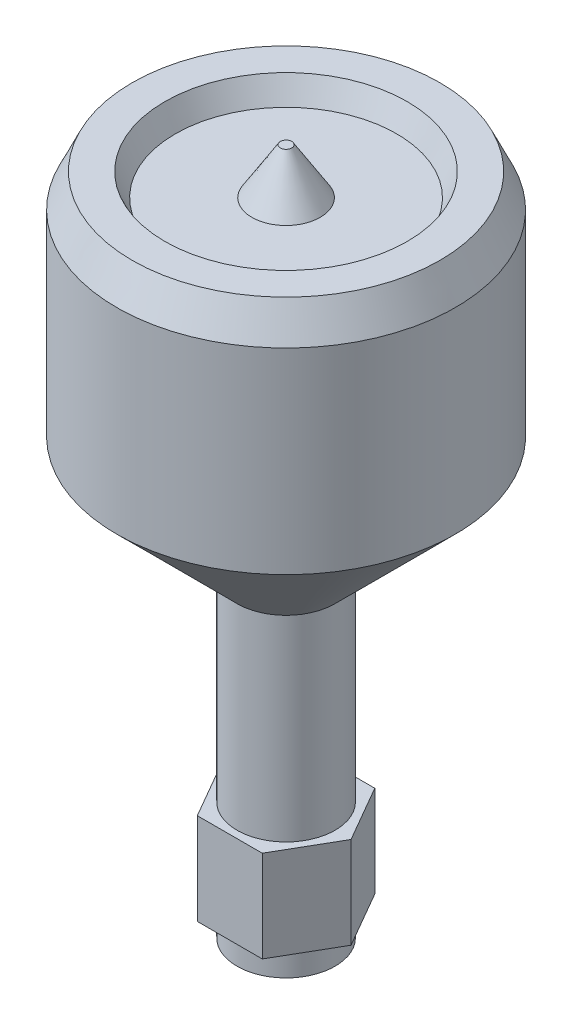
ISO-10303-21;
HEADER;
FILE_DESCRIPTION(('STEP AP214'),'2;1');
FILE_NAME('part.step','',(''),(''),'','','');
FILE_SCHEMA(('AUTOMOTIVE_DESIGN { 1 0 10303 214 1 1 1 1 }'));
ENDSEC;
DATA;
#1=APPLICATION_CONTEXT('core data for automotive mechanical design processes');
#2=APPLICATION_PROTOCOL_DEFINITION('international standard','automotive_design',2000,#1);
#3=PRODUCT_CONTEXT('',#1,'mechanical');
#4=PRODUCT('Part','Part','',(#3));
#5=PRODUCT_RELATED_PRODUCT_CATEGORY('part','',(#4));
#6=PRODUCT_DEFINITION_FORMATION('','',#4);
#7=PRODUCT_DEFINITION_CONTEXT('part definition',#1,'design');
#8=PRODUCT_DEFINITION('design','',#6,#7);
#9=PRODUCT_DEFINITION_SHAPE('','',#8);
#10=(LENGTH_UNIT() NAMED_UNIT(*) SI_UNIT(.MILLI.,.METRE.));
#11=(NAMED_UNIT(*) PLANE_ANGLE_UNIT() SI_UNIT($,.RADIAN.));
#12=(NAMED_UNIT(*) SI_UNIT($,.STERADIAN.) SOLID_ANGLE_UNIT());
#13=UNCERTAINTY_MEASURE_WITH_UNIT(LENGTH_MEASURE(1.E-05),#10,'distance_accuracy_value','');
#14=(GEOMETRIC_REPRESENTATION_CONTEXT(3) GLOBAL_UNCERTAINTY_ASSIGNED_CONTEXT((#13)) GLOBAL_UNIT_ASSIGNED_CONTEXT((#10,
#11,#12)) REPRESENTATION_CONTEXT('',''));
#15=CARTESIAN_POINT('',(0.,0.,0.));
#16=DIRECTION('',(0.,0.,1.));
#17=DIRECTION('',(1.,0.,0.));
#18=AXIS2_PLACEMENT_3D('',#15,#16,#17);
#19=CARTESIAN_POINT('',(2.48260615751539,9.,-4.3));
#20=DIRECTION('',(0.,1.,0.));
#21=DIRECTION('',(-1.,0.,0.));
#22=AXIS2_PLACEMENT_3D('',#19,#20,#21);
#23=PLANE('',#22);
#24=DIRECTION('',(0.5,0.,0.866025403784439));
#25=VECTOR('',#24,1.);
#26=CARTESIAN_POINT('',(2.48260615751539,9.,-4.3));
#27=LINE('',#26,#25);
#28=CARTESIAN_POINT('',(2.48260615751539,9.,-4.3));
#29=VERTEX_POINT('',#28);
#30=CARTESIAN_POINT('',(4.96521231503078,9.,0.));
#31=VERTEX_POINT('',#30);
#32=EDGE_CURVE('E47',#29,#31,#27,.T.);
#33=ORIENTED_EDGE('',*,*,#32,.F.);
#34=DIRECTION('',(1.,0.,0.));
#35=VECTOR('',#34,1.);
#36=CARTESIAN_POINT('',(-2.48260615751539,9.,-4.3));
#37=LINE('',#36,#35);
#38=CARTESIAN_POINT('',(-2.48260615751539,9.,-4.3));
#39=VERTEX_POINT('',#38);
#40=EDGE_CURVE('E129',#39,#29,#37,.T.);
#41=ORIENTED_EDGE('',*,*,#40,.F.);
#42=DIRECTION('',(0.5,0.,-0.866025403784438));
#43=VECTOR('',#42,1.);
#44=CARTESIAN_POINT('',(-4.96521231503078,9.,0.));
#45=LINE('',#44,#43);
#46=CARTESIAN_POINT('',(-4.96521231503078,9.,0.));
#47=VERTEX_POINT('',#46);
#48=EDGE_CURVE('E131',#47,#39,#45,.T.);
#49=ORIENTED_EDGE('',*,*,#48,.F.);
#50=DIRECTION('',(-0.5,0.,-0.866025403784439));
#51=VECTOR('',#50,1.);
#52=CARTESIAN_POINT('',(-2.48260615751539,9.,4.3));
#53=LINE('',#52,#51);
#54=CARTESIAN_POINT('',(-2.48260615751539,9.,4.3));
#55=VERTEX_POINT('',#54);
#56=EDGE_CURVE('E134',#55,#47,#53,.T.);
#57=ORIENTED_EDGE('',*,*,#56,.F.);
#58=DIRECTION('',(-1.,0.,0.));
#59=VECTOR('',#58,1.);
#60=CARTESIAN_POINT('',(2.48260615751539,9.,4.3));
#61=LINE('',#60,#59);
#62=CARTESIAN_POINT('',(2.48260615751539,9.,4.3));
#63=VERTEX_POINT('',#62);
#64=EDGE_CURVE('E110',#63,#55,#61,.T.);
#65=ORIENTED_EDGE('',*,*,#64,.F.);
#66=DIRECTION('',(-0.5,0.,0.866025403784438));
#67=VECTOR('',#66,1.);
#68=CARTESIAN_POINT('',(4.96521231503078,9.,0.));
#69=LINE('',#68,#67);
#70=EDGE_CURVE('E136',#31,#63,#69,.T.);
#71=ORIENTED_EDGE('',*,*,#70,.F.);
#72=EDGE_LOOP('',(#33,#41,#49,#57,#65,#71));
#73=FACE_BOUND('',#72,.T.);
#74=ADVANCED_FACE('F44',(#73),#23,.T.);
#75=CARTESIAN_POINT('',(0.,0.,0.));
#76=DIRECTION('',(0.,-1.,0.));
#77=DIRECTION('',(1.,0.,0.));
#78=AXIS2_PLACEMENT_3D('',#75,#76,#77);
#79=PLANE('',#78);
#80=CARTESIAN_POINT('',(0.,0.,0.));
#81=DIRECTION('',(0.,1.,0.));
#82=DIRECTION('',(-1.,0.,0.));
#83=AXIS2_PLACEMENT_3D('',#80,#81,#82);
#84=CIRCLE('',#83,3.75);
#85=CARTESIAN_POINT('',(-3.75,0.,0.));
#86=VERTEX_POINT('',#85);
#87=EDGE_CURVE('E151',#86,#86,#84,.T.);
#88=ORIENTED_EDGE('',*,*,#87,.F.);
#89=EDGE_LOOP('',(#88));
#90=FACE_BOUND('',#89,.T.);
#91=ADVANCED_FACE('F158',(#90),#79,.T.);
#92=CARTESIAN_POINT('',(0.,52.5,0.));
#93=DIRECTION('',(0.,1.,0.));
#94=DIRECTION('',(-1.,0.,0.));
#95=AXIS2_PLACEMENT_3D('',#92,#93,#94);
#96=CYLINDRICAL_SURFACE('',#95,3.75);
#97=ORIENTED_EDGE('',*,*,#87,.T.);
#98=EDGE_LOOP('',(#97));
#99=FACE_BOUND('',#98,.T.);
#100=CARTESIAN_POINT('',(0.,2.,0.));
#101=DIRECTION('',(0.,1.,0.));
#102=DIRECTION('',(-1.,0.,0.));
#103=AXIS2_PLACEMENT_3D('',#100,#101,#102);
#104=CIRCLE('',#103,3.75);
#105=CARTESIAN_POINT('',(-3.75,2.,0.));
#106=VERTEX_POINT('',#105);
#107=EDGE_CURVE('E144',#106,#106,#104,.T.);
#108=ORIENTED_EDGE('',*,*,#107,.F.);
#109=EDGE_LOOP('',(#108));
#110=FACE_BOUND('',#109,.T.);
#111=ADVANCED_FACE('F155',(#99,#110),#96,.T.);
#112=CARTESIAN_POINT('',(-2.48260615751539,9.,-4.3));
#113=DIRECTION('',(0.,0.,-1.));
#114=DIRECTION('',(-1.,0.,0.));
#115=AXIS2_PLACEMENT_3D('',#112,#113,#114);
#116=PLANE('',#115);
#117=DIRECTION('',(1.,0.,0.));
#118=VECTOR('',#117,1.);
#119=CARTESIAN_POINT('',(-2.48260615751539,2.,-4.3));
#120=LINE('',#119,#118);
#121=CARTESIAN_POINT('',(-2.48260615751539,2.,-4.3));
#122=VERTEX_POINT('',#121);
#123=CARTESIAN_POINT('',(2.48260615751539,2.,-4.3));
#124=VERTEX_POINT('',#123);
#125=EDGE_CURVE('E137',#122,#124,#120,.T.);
#126=ORIENTED_EDGE('',*,*,#125,.F.);
#127=DIRECTION('',(0.,-1.,0.));
#128=VECTOR('',#127,1.);
#129=CARTESIAN_POINT('',(-2.48260615751539,9.,-4.3));
#130=LINE('',#129,#128);
#131=EDGE_CURVE('E143',#39,#122,#130,.T.);
#132=ORIENTED_EDGE('',*,*,#131,.F.);
#133=ORIENTED_EDGE('',*,*,#40,.T.);
#134=DIRECTION('',(0.,-1.,0.));
#135=VECTOR('',#134,1.);
#136=CARTESIAN_POINT('',(2.48260615751539,9.,-4.3));
#137=LINE('',#136,#135);
#138=EDGE_CURVE('E97',#29,#124,#137,.T.);
#139=ORIENTED_EDGE('',*,*,#138,.T.);
#140=EDGE_LOOP('',(#126,#132,#133,#139));
#141=FACE_BOUND('',#140,.T.);
#142=ADVANCED_FACE('F165',(#141),#116,.T.);
#143=CARTESIAN_POINT('',(-4.96521231503078,9.,0.));
#144=DIRECTION('',(-0.866025403784438,0.,-0.5));
#145=DIRECTION('',(-0.5,0.,0.866025403784439));
#146=AXIS2_PLACEMENT_3D('',#143,#144,#145);
#147=PLANE('',#146);
#148=DIRECTION('',(0.5,0.,-0.866025403784438));
#149=VECTOR('',#148,1.);
#150=CARTESIAN_POINT('',(-4.96521231503078,2.,0.));
#151=LINE('',#150,#149);
#152=CARTESIAN_POINT('',(-4.96521231503078,2.,0.));
#153=VERTEX_POINT('',#152);
#154=EDGE_CURVE('E122',#153,#122,#151,.T.);
#155=ORIENTED_EDGE('',*,*,#154,.F.);
#156=DIRECTION('',(0.,-1.,0.));
#157=VECTOR('',#156,1.);
#158=CARTESIAN_POINT('',(-4.96521231503078,9.,0.));
#159=LINE('',#158,#157);
#160=EDGE_CURVE('E114',#47,#153,#159,.T.);
#161=ORIENTED_EDGE('',*,*,#160,.F.);
#162=ORIENTED_EDGE('',*,*,#48,.T.);
#163=ORIENTED_EDGE('',*,*,#131,.T.);
#164=EDGE_LOOP('',(#155,#161,#162,#163));
#165=FACE_BOUND('',#164,.T.);
#166=ADVANCED_FACE('F182',(#165),#147,.T.);
#167=CARTESIAN_POINT('',(-2.48260615751539,9.,4.3));
#168=DIRECTION('',(-0.866025403784439,0.,0.5));
#169=DIRECTION('',(0.5,0.,0.866025403784439));
#170=AXIS2_PLACEMENT_3D('',#167,#168,#169);
#171=PLANE('',#170);
#172=DIRECTION('',(-0.5,0.,-0.866025403784439));
#173=VECTOR('',#172,1.);
#174=CARTESIAN_POINT('',(-2.48260615751539,2.,4.3));
#175=LINE('',#174,#173);
#176=CARTESIAN_POINT('',(-2.48260615751539,2.,4.3));
#177=VERTEX_POINT('',#176);
#178=EDGE_CURVE('E117',#177,#153,#175,.T.);
#179=ORIENTED_EDGE('',*,*,#178,.F.);
#180=DIRECTION('',(0.,-1.,0.));
#181=VECTOR('',#180,1.);
#182=CARTESIAN_POINT('',(-2.48260615751539,9.,4.3));
#183=LINE('',#182,#181);
#184=EDGE_CURVE('E104',#55,#177,#183,.T.);
#185=ORIENTED_EDGE('',*,*,#184,.F.);
#186=ORIENTED_EDGE('',*,*,#56,.T.);
#187=ORIENTED_EDGE('',*,*,#160,.T.);
#188=EDGE_LOOP('',(#179,#185,#186,#187));
#189=FACE_BOUND('',#188,.T.);
#190=ADVANCED_FACE('F118',(#189),#171,.T.);
#191=CARTESIAN_POINT('',(2.48260615751539,9.,4.3));
#192=DIRECTION('',(0.,0.,1.));
#193=DIRECTION('',(1.,0.,0.));
#194=AXIS2_PLACEMENT_3D('',#191,#192,#193);
#195=PLANE('',#194);
#196=DIRECTION('',(-1.,0.,0.));
#197=VECTOR('',#196,1.);
#198=CARTESIAN_POINT('',(2.48260615751539,2.,4.3));
#199=LINE('',#198,#197);
#200=CARTESIAN_POINT('',(2.48260615751539,2.,4.3));
#201=VERTEX_POINT('',#200);
#202=EDGE_CURVE('E108',#201,#177,#199,.T.);
#203=ORIENTED_EDGE('',*,*,#202,.F.);
#204=DIRECTION('',(0.,-1.,0.));
#205=VECTOR('',#204,1.);
#206=CARTESIAN_POINT('',(2.48260615751539,9.,4.3));
#207=LINE('',#206,#205);
#208=EDGE_CURVE('E85',#63,#201,#207,.T.);
#209=ORIENTED_EDGE('',*,*,#208,.F.);
#210=ORIENTED_EDGE('',*,*,#64,.T.);
#211=ORIENTED_EDGE('',*,*,#184,.T.);
#212=EDGE_LOOP('',(#203,#209,#210,#211));
#213=FACE_BOUND('',#212,.T.);
#214=ADVANCED_FACE('F106',(#213),#195,.T.);
#215=CARTESIAN_POINT('',(2.48260615751539,9.,-4.3));
#216=DIRECTION('',(0.866025403784439,0.,-0.5));
#217=DIRECTION('',(-0.5,0.,-0.866025403784439));
#218=AXIS2_PLACEMENT_3D('',#215,#216,#217);
#219=PLANE('',#218);
#220=DIRECTION('',(0.5,0.,0.866025403784439));
#221=VECTOR('',#220,1.);
#222=CARTESIAN_POINT('',(2.48260615751539,2.,-4.3));
#223=LINE('',#222,#221);
#224=CARTESIAN_POINT('',(4.96521231503078,2.,0.));
#225=VERTEX_POINT('',#224);
#226=EDGE_CURVE('E13',#124,#225,#223,.T.);
#227=ORIENTED_EDGE('',*,*,#226,.F.);
#228=ORIENTED_EDGE('',*,*,#138,.F.);
#229=ORIENTED_EDGE('',*,*,#32,.T.);
#230=DIRECTION('',(0.,-1.,0.));
#231=VECTOR('',#230,1.);
#232=CARTESIAN_POINT('',(4.96521231503078,9.,0.));
#233=LINE('',#232,#231);
#234=EDGE_CURVE('E62',#31,#225,#233,.T.);
#235=ORIENTED_EDGE('',*,*,#234,.T.);
#236=EDGE_LOOP('',(#227,#228,#229,#235));
#237=FACE_BOUND('',#236,.T.);
#238=ADVANCED_FACE('F172',(#237),#219,.T.);
#239=CARTESIAN_POINT('',(-3.75,2.,0.));
#240=DIRECTION('',(0.,-1.,0.));
#241=DIRECTION('',(1.,0.,0.));
#242=AXIS2_PLACEMENT_3D('',#239,#240,#241);
#243=PLANE('',#242);
#244=ORIENTED_EDGE('',*,*,#107,.T.);
#245=EDGE_LOOP('',(#244));
#246=FACE_BOUND('',#245,.T.);
#247=ORIENTED_EDGE('',*,*,#226,.T.);
#248=DIRECTION('',(-0.5,0.,0.866025403784438));
#249=VECTOR('',#248,1.);
#250=CARTESIAN_POINT('',(4.96521231503078,2.,0.));
#251=LINE('',#250,#249);
#252=EDGE_CURVE('E53',#225,#201,#251,.T.);
#253=ORIENTED_EDGE('',*,*,#252,.T.);
#254=ORIENTED_EDGE('',*,*,#202,.T.);
#255=ORIENTED_EDGE('',*,*,#178,.T.);
#256=ORIENTED_EDGE('',*,*,#154,.T.);
#257=ORIENTED_EDGE('',*,*,#125,.T.);
#258=EDGE_LOOP('',(#247,#253,#254,#255,#256,#257));
#259=FACE_BOUND('',#258,.T.);
#260=ADVANCED_FACE('F124',(#246,#259),#243,.T.);
#261=CARTESIAN_POINT('',(4.96521231503078,9.,0.));
#262=DIRECTION('',(0.866025403784438,0.,0.5));
#263=DIRECTION('',(0.5,0.,-0.866025403784439));
#264=AXIS2_PLACEMENT_3D('',#261,#262,#263);
#265=PLANE('',#264);
#266=ORIENTED_EDGE('',*,*,#252,.F.);
#267=ORIENTED_EDGE('',*,*,#234,.F.);
#268=ORIENTED_EDGE('',*,*,#70,.T.);
#269=ORIENTED_EDGE('',*,*,#208,.T.);
#270=EDGE_LOOP('',(#266,#267,#268,#269));
#271=FACE_BOUND('',#270,.T.);
#272=ADVANCED_FACE('F168',(#271),#265,.T.);
#273=CLOSED_SHELL('',(#74,#91,#111,#142,#166,#190,#214,#238,#260,#272));
#274=MANIFOLD_SOLID_BREP('B2',#273);
#275=CARTESIAN_POINT('',(2.48260615751539,9.,-4.3));
#276=DIRECTION('',(0.,1.,0.));
#277=DIRECTION('',(-1.,0.,0.));
#278=AXIS2_PLACEMENT_3D('',#275,#276,#277);
#279=PLANE('',#278);
#280=CARTESIAN_POINT('',(0.,9.,0.));
#281=DIRECTION('',(0.,1.,0.));
#282=DIRECTION('',(-1.,0.,0.));
#283=AXIS2_PLACEMENT_3D('',#280,#281,#282);
#284=CIRCLE('',#283,3.75);
#285=CARTESIAN_POINT('',(-3.75,9.,0.));
#286=VERTEX_POINT('',#285);
#287=EDGE_CURVE('E43',#286,#286,#284,.T.);
#288=ORIENTED_EDGE('',*,*,#287,.F.);
#289=EDGE_LOOP('',(#288));
#290=FACE_BOUND('',#289,.T.);
#291=ADVANCED_FACE('F262',(#290),#279,.F.);
#292=CARTESIAN_POINT('',(0.,52.5,0.));
#293=DIRECTION('',(0.,1.,0.));
#294=DIRECTION('',(-1.,0.,0.));
#295=AXIS2_PLACEMENT_3D('',#292,#293,#294);
#296=CYLINDRICAL_SURFACE('',#295,3.75);
#297=ORIENTED_EDGE('',*,*,#287,.T.);
#298=EDGE_LOOP('',(#297));
#299=FACE_BOUND('',#298,.T.);
#300=CARTESIAN_POINT('',(0.,24.,0.));
#301=DIRECTION('',(0.,1.,0.));
#302=DIRECTION('',(-1.,0.,0.));
#303=AXIS2_PLACEMENT_3D('',#300,#301,#302);
#304=CIRCLE('',#303,3.75);
#305=CARTESIAN_POINT('',(-3.75,24.,0.));
#306=VERTEX_POINT('',#305);
#307=EDGE_CURVE('E268',#306,#306,#304,.T.);
#308=ORIENTED_EDGE('',*,*,#307,.F.);
#309=EDGE_LOOP('',(#308));
#310=FACE_BOUND('',#309,.T.);
#311=ADVANCED_FACE('F313',(#299,#310),#296,.T.);
#312=CARTESIAN_POINT('',(0.,33.1923881554251,0.));
#313=DIRECTION('',(0.,1.,0.));
#314=DIRECTION('',(-1.,0.,0.));
#315=AXIS2_PLACEMENT_3D('',#312,#313,#314);
#316=CONICAL_SURFACE('',#315,12.9423881554251,0.785398163397448);
#317=CARTESIAN_POINT('',(0.,33.1923881554251,0.));
#318=DIRECTION('',(0.,1.,0.));
#319=DIRECTION('',(-1.,0.,0.));
#320=AXIS2_PLACEMENT_3D('',#317,#318,#319);
#321=CIRCLE('',#320,12.9423881554251);
#322=CARTESIAN_POINT('',(-12.9423881554251,33.1923881554251,0.));
#323=VERTEX_POINT('',#322);
#324=EDGE_CURVE('E272',#323,#323,#321,.T.);
#325=CARTESIAN_POINT('',(-3.75,24.,0.));
#326=CARTESIAN_POINT('',(-3.84575404328567,24.0957540432857,0.));
#327=CARTESIAN_POINT('',(-3.94150808657135,24.1915080865714,0.));
#328=CARTESIAN_POINT('',(-4.13301617314271,24.3830161731427,0.));
#329=CARTESIAN_POINT('',(-4.22877021642839,24.4787702164284,0.));
#330=CARTESIAN_POINT('',(-4.42027830299974,24.6702783029997,0.));
#331=CARTESIAN_POINT('',(-4.51603234628542,24.7660323462854,0.));
#332=CARTESIAN_POINT('',(-4.70754043285678,24.9575404328568,0.));
#333=CARTESIAN_POINT('',(-4.80329447614245,25.0532944761425,0.));
#334=CARTESIAN_POINT('',(-4.99480256271381,25.2448025627138,0.));
#335=CARTESIAN_POINT('',(-5.09055660599949,25.3405566059995,0.));
#336=CARTESIAN_POINT('',(-5.28206469257085,25.5320646925709,0.));
#337=CARTESIAN_POINT('',(-5.37781873585653,25.6278187358565,0.));
#338=CARTESIAN_POINT('',(-5.56932682242788,25.8193268224279,0.));
#339=CARTESIAN_POINT('',(-5.66508086571356,25.9150808657136,0.));
#340=CARTESIAN_POINT('',(-5.85658895228492,26.1065889522849,0.));
#341=CARTESIAN_POINT('',(-5.9523429955706,26.2023429955706,0.));
#342=CARTESIAN_POINT('',(-6.14385108214195,26.393851082142,0.));
#343=CARTESIAN_POINT('',(-6.23960512542763,26.4896051254276,0.));
#344=CARTESIAN_POINT('',(-6.43111321199899,26.681113211999,0.));
#345=CARTESIAN_POINT('',(-6.52686725528466,26.7768672552847,0.));
#346=CARTESIAN_POINT('',(-6.71837534185602,26.968375341856,0.));
#347=CARTESIAN_POINT('',(-6.8141293851417,27.0641293851417,0.));
#348=CARTESIAN_POINT('',(-7.00563747171306,27.2556374717131,0.));
#349=CARTESIAN_POINT('',(-7.10139151499874,27.3513915149987,0.));
#350=CARTESIAN_POINT('',(-7.29289960157009,27.5428996015701,0.));
#351=CARTESIAN_POINT('',(-7.38865364485577,27.6386536448558,0.));
#352=CARTESIAN_POINT('',(-7.58016173142713,27.8301617314271,0.));
#353=CARTESIAN_POINT('',(-7.67591577471281,27.9259157747128,0.));
#354=CARTESIAN_POINT('',(-7.86742386128416,28.1174238612842,0.));
#355=CARTESIAN_POINT('',(-7.96317790456984,28.2131779045698,0.));
#356=CARTESIAN_POINT('',(-8.1546859911412,28.4046859911412,0.));
#357=CARTESIAN_POINT('',(-8.25044003442687,28.5004400344269,0.));
#358=CARTESIAN_POINT('',(-8.44194812099823,28.6919481209982,0.));
#359=CARTESIAN_POINT('',(-8.53770216428391,28.7877021642839,0.));
#360=CARTESIAN_POINT('',(-8.72921025085527,28.9792102508553,0.));
#361=CARTESIAN_POINT('',(-8.82496429414094,29.074964294141,0.));
#362=CARTESIAN_POINT('',(-9.0164723807123,29.2664723807123,0.));
#363=CARTESIAN_POINT('',(-9.11222642399798,29.362226423998,0.));
#364=CARTESIAN_POINT('',(-9.30373451056934,29.5537345105693,0.));
#365=CARTESIAN_POINT('',(-9.39948855385501,29.649488553855,0.));
#366=CARTESIAN_POINT('',(-9.59099664042637,29.8409966404264,0.));
#367=CARTESIAN_POINT('',(-9.68675068371205,29.9367506837121,0.));
#368=CARTESIAN_POINT('',(-9.87825877028341,30.1282587702834,0.));
#369=CARTESIAN_POINT('',(-9.97401281356908,30.2240128135691,0.));
#370=CARTESIAN_POINT('',(-10.1655209001404,30.4155209001404,0.));
#371=CARTESIAN_POINT('',(-10.2612749434261,30.5112749434261,0.));
#372=CARTESIAN_POINT('',(-10.4527830299975,30.7027830299975,0.));
#373=CARTESIAN_POINT('',(-10.5485370732832,30.7985370732832,0.));
#374=CARTESIAN_POINT('',(-10.7400451598545,30.9900451598545,0.));
#375=CARTESIAN_POINT('',(-10.8357992031402,31.0857992031402,0.));
#376=CARTESIAN_POINT('',(-11.0273072897115,31.2773072897116,0.));
#377=CARTESIAN_POINT('',(-11.1230613329972,31.3730613329972,0.));
#378=CARTESIAN_POINT('',(-11.3145694195686,31.5645694195686,0.));
#379=CARTESIAN_POINT('',(-11.4103234628543,31.6603234628543,0.));
#380=CARTESIAN_POINT('',(-11.6018315494256,31.8518315494256,0.));
#381=CARTESIAN_POINT('',(-11.6975855927113,31.9475855927113,0.));
#382=CARTESIAN_POINT('',(-11.8890936792826,32.1390936792827,0.));
#383=CARTESIAN_POINT('',(-11.9848477225683,32.2348477225683,0.));
#384=CARTESIAN_POINT('',(-12.1763558091397,32.4263558091397,0.));
#385=CARTESIAN_POINT('',(-12.2721098524254,32.5221098524254,0.));
#386=CARTESIAN_POINT('',(-12.4636179389967,32.7136179389967,0.));
#387=CARTESIAN_POINT('',(-12.5593719822824,32.8093719822824,0.));
#388=CARTESIAN_POINT('',(-12.7508800688538,33.0008800688538,0.));
#389=CARTESIAN_POINT('',(-12.8466341121394,33.0966341121394,0.));
#390=CARTESIAN_POINT('',(-12.9423881554251,33.1923881554251,0.));
#391=B_SPLINE_CURVE_WITH_KNOTS('',3,(#325,#326,#327,#328,#329,#330,#331,#332,#333,#334,#335,
#336,#337,#338,#339,#340,#341,#342,#343,#344,#345,#346,#347,#348,#349,#350,#351,#352,#353,#354,
#355,#356,#357,#358,#359,#360,#361,#362,#363,#364,#365,#366,#367,#368,#369,#370,#371,#372,#373,
#374,#375,#376,#377,#378,#379,#380,#381,#382,#383,#384,#385,#386,#387,#388,#389,#390),
.UNSPECIFIED.,.F.,.F.,(4,2,2,2,2,2,2,2,2,2,2,2,2,2,2,2,2,2,2,2,2,2,2,2,2,2,2,2,2,2,2,2,4),(0.,
0.406249999999999,0.812499999999999,1.21875,1.625,2.03125,2.4375,2.84375,3.25,3.65625,4.0625,
4.46875,4.875,5.28125,5.6875,6.09375,6.5,6.90625,7.3125,7.71875,8.125,8.53125,8.9375,9.34375,
9.75,10.15625,10.5625,10.96875,11.375,11.78125,12.1875,12.59375,13.),.UNSPECIFIED.);
#392=EDGE_CURVE('BSEAM318',#306,#323,#391,.T.);
#393=ORIENTED_EDGE('',*,*,#307,.T.);
#394=ORIENTED_EDGE('',*,*,#324,.F.);
#395=ORIENTED_EDGE('',*,*,#392,.T.);
#396=ORIENTED_EDGE('',*,*,#392,.F.);
#397=EDGE_LOOP('',(#393,#395,#394,#396));
#398=FACE_BOUND('',#397,.T.);
#399=ADVANCED_FACE('F318',(#398),#316,.T.);
#400=CARTESIAN_POINT('',(0.,52.5,0.));
#401=DIRECTION('',(0.,1.,0.));
#402=DIRECTION('',(-1.,0.,0.));
#403=AXIS2_PLACEMENT_3D('',#400,#401,#402);
#404=CYLINDRICAL_SURFACE('',#403,12.9423881554251);
#405=ORIENTED_EDGE('',*,*,#324,.T.);
#406=EDGE_LOOP('',(#405));
#407=FACE_BOUND('',#406,.T.);
#408=CARTESIAN_POINT('',(0.,48.1923881554251,0.));
#409=DIRECTION('',(0.,1.,0.));
#410=DIRECTION('',(-1.,0.,0.));
#411=AXIS2_PLACEMENT_3D('',#408,#409,#410);
#412=CIRCLE('',#411,12.9423881554251);
#413=CARTESIAN_POINT('',(-12.9423881554251,48.1923881554251,0.));
#414=VERTEX_POINT('',#413);
#415=EDGE_CURVE('E276',#414,#414,#412,.T.);
#416=ORIENTED_EDGE('',*,*,#415,.F.);
#417=EDGE_LOOP('',(#416));
#418=FACE_BOUND('',#417,.T.);
#419=ADVANCED_FACE('F322',(#407,#418),#404,.T.);
#420=CARTESIAN_POINT('',(0.,50.7251550580271,0.));
#421=DIRECTION('',(0.,-1.,0.));
#422=DIRECTION('',(1.,0.,0.));
#423=AXIS2_PLACEMENT_3D('',#420,#421,#422);
#424=CONICAL_SURFACE('',#423,11.7613395524203,0.436332312998584);
#425=ORIENTED_EDGE('',*,*,#415,.T.);
#426=EDGE_LOOP('',(#425));
#427=FACE_BOUND('',#426,.T.);
#428=CARTESIAN_POINT('',(0.,50.7251550580271,0.));
#429=DIRECTION('',(0.,1.,0.));
#430=DIRECTION('',(-1.,0.,0.));
#431=AXIS2_PLACEMENT_3D('',#428,#429,#430);
#432=CIRCLE('',#431,11.7613395524203);
#433=CARTESIAN_POINT('',(-11.7613395524203,50.7251550580271,0.));
#434=VERTEX_POINT('',#433);
#435=EDGE_CURVE('E281',#434,#434,#432,.T.);
#436=ORIENTED_EDGE('',*,*,#435,.F.);
#437=EDGE_LOOP('',(#436));
#438=FACE_BOUND('',#437,.T.);
#439=ADVANCED_FACE('F328',(#427,#438),#424,.T.);
#440=CARTESIAN_POINT('',(-11.7613395524203,50.7251550580271,0.));
#441=DIRECTION('',(0.,1.,0.));
#442=DIRECTION('',(-1.,0.,0.));
#443=AXIS2_PLACEMENT_3D('',#440,#441,#442);
#444=PLANE('',#443);
#445=ORIENTED_EDGE('',*,*,#435,.T.);
#446=EDGE_LOOP('',(#445));
#447=FACE_BOUND('',#446,.T.);
#448=CARTESIAN_POINT('',(0.,50.7251550580271,0.));
#449=DIRECTION('',(0.,1.,0.));
#450=DIRECTION('',(-1.,0.,0.));
#451=AXIS2_PLACEMENT_3D('',#448,#449,#450);
#452=CIRCLE('',#451,9.26133955242027);
#453=CARTESIAN_POINT('',(-9.26133955242027,50.7251550580271,0.));
#454=VERTEX_POINT('',#453);
#455=EDGE_CURVE('E284',#454,#454,#452,.T.);
#456=ORIENTED_EDGE('',*,*,#455,.F.);
#457=EDGE_LOOP('',(#456));
#458=FACE_BOUND('',#457,.T.);
#459=ADVANCED_FACE('F332',(#447,#458),#444,.T.);
#460=CARTESIAN_POINT('',(0.,48.9970886284423,0.));
#461=DIRECTION('',(0.,1.,0.));
#462=DIRECTION('',(-1.,0.,0.));
#463=AXIS2_PLACEMENT_3D('',#460,#461,#462);
#464=CONICAL_SURFACE('',#463,8.4555289425043,0.436332312998582);
#465=ORIENTED_EDGE('',*,*,#455,.T.);
#466=EDGE_LOOP('',(#465));
#467=FACE_BOUND('',#466,.T.);
#468=CARTESIAN_POINT('',(0.,48.9970886284423,0.));
#469=DIRECTION('',(0.,1.,0.));
#470=DIRECTION('',(-1.,0.,0.));
#471=AXIS2_PLACEMENT_3D('',#468,#469,#470);
#472=CIRCLE('',#471,8.4555289425043);
#473=CARTESIAN_POINT('',(-8.4555289425043,48.9970886284423,0.));
#474=VERTEX_POINT('',#473);
#475=EDGE_CURVE('E287',#474,#474,#472,.T.);
#476=ORIENTED_EDGE('',*,*,#475,.F.);
#477=EDGE_LOOP('',(#476));
#478=FACE_BOUND('',#477,.T.);
#479=ADVANCED_FACE('F309',(#467,#478),#464,.F.);
#480=CARTESIAN_POINT('',(-8.4555289425043,48.9970886284423,0.));
#481=DIRECTION('',(0.,1.,0.));
#482=DIRECTION('',(-1.,0.,0.));
#483=AXIS2_PLACEMENT_3D('',#480,#481,#482);
#484=PLANE('',#483);
#485=ORIENTED_EDGE('',*,*,#475,.T.);
#486=EDGE_LOOP('',(#485));
#487=FACE_BOUND('',#486,.T.);
#488=CARTESIAN_POINT('',(0.,48.9970886284423,0.));
#489=DIRECTION('',(0.,1.,0.));
#490=DIRECTION('',(-1.,0.,0.));
#491=AXIS2_PLACEMENT_3D('',#488,#489,#490);
#492=CIRCLE('',#491,2.61237830679138);
#493=CARTESIAN_POINT('',(2.61237830679137,48.9970886284423,0.));
#494=VERTEX_POINT('',#493);
#495=EDGE_CURVE('E290',#494,#494,#492,.T.);
#496=ORIENTED_EDGE('',*,*,#495,.F.);
#497=EDGE_LOOP('',(#496));
#498=FACE_BOUND('',#497,.T.);
#499=ADVANCED_FACE('F301',(#487,#498),#484,.T.);
#500=CARTESIAN_POINT('',(0.,52.5,0.));
#501=DIRECTION('',(0.,-1.,0.));
#502=DIRECTION('',(1.,0.,0.));
#503=AXIS2_PLACEMENT_3D('',#500,#501,#502);
#504=CONICAL_SURFACE('',#503,0.434974260568379,0.556149468648657);
#505=CARTESIAN_POINT('',(0.,52.5,0.));
#506=DIRECTION('',(0.,1.,0.));
#507=DIRECTION('',(-1.,0.,0.));
#508=AXIS2_PLACEMENT_3D('',#505,#506,#507);
#509=CIRCLE('',#508,0.434974260568379);
#510=CARTESIAN_POINT('',(0.434974260568376,52.5,0.));
#511=VERTEX_POINT('',#510);
#512=EDGE_CURVE('E293',#511,#511,#509,.T.);
#513=CARTESIAN_POINT('',(2.61237830679137,48.9970886284423,0.));
#514=CARTESIAN_POINT('',(2.58969701464322,49.0335772885627,0.));
#515=CARTESIAN_POINT('',(2.56701572249506,49.0700659486831,0.));
#516=CARTESIAN_POINT('',(2.52165313819875,49.1430432689239,0.));
#517=CARTESIAN_POINT('',(2.49897184605059,49.1795319290443,0.));
#518=CARTESIAN_POINT('',(2.45360926175428,49.2525092492851,0.));
#519=CARTESIAN_POINT('',(2.43092796960612,49.2889979094055,0.));
#520=CARTESIAN_POINT('',(2.38556538530981,49.3619752296462,0.));
#521=CARTESIAN_POINT('',(2.36288409316166,49.3984638897666,0.));
#522=CARTESIAN_POINT('',(2.31752150886534,49.4714412100074,0.));
#523=CARTESIAN_POINT('',(2.29484021671719,49.5079298701278,0.));
#524=CARTESIAN_POINT('',(2.24947763242087,49.5809071903686,0.));
#525=CARTESIAN_POINT('',(2.22679634027272,49.617395850489,0.));
#526=CARTESIAN_POINT('',(2.18143375597641,49.6903731707298,0.));
#527=CARTESIAN_POINT('',(2.15875246382825,49.7268618308502,0.));
#528=CARTESIAN_POINT('',(2.11338987953194,49.7998391510909,0.));
#529=CARTESIAN_POINT('',(2.09070858738378,49.8363278112113,0.));
#530=CARTESIAN_POINT('',(2.04534600308747,49.9093051314521,0.));
#531=CARTESIAN_POINT('',(2.02266471093931,49.9457937915725,0.));
#532=CARTESIAN_POINT('',(1.977302126643,50.0187711118133,0.));
#533=CARTESIAN_POINT('',(1.95462083449484,50.0552597719337,0.));
#534=CARTESIAN_POINT('',(1.90925825019853,50.1282370921745,0.));
#535=CARTESIAN_POINT('',(1.88657695805037,50.1647257522949,0.));
#536=CARTESIAN_POINT('',(1.84121437375406,50.2377030725357,0.));
#537=CARTESIAN_POINT('',(1.81853308160591,50.2741917326561,0.));
#538=CARTESIAN_POINT('',(1.77317049730959,50.3471690528968,0.));
#539=CARTESIAN_POINT('',(1.75048920516144,50.3836577130172,0.));
#540=CARTESIAN_POINT('',(1.70512662086512,50.456635033258,0.));
#541=CARTESIAN_POINT('',(1.68244532871697,50.4931236933784,0.));
#542=CARTESIAN_POINT('',(1.63708274442066,50.5661010136192,0.));
#543=CARTESIAN_POINT('',(1.6144014522725,50.6025896737396,0.));
#544=CARTESIAN_POINT('',(1.56903886797619,50.6755669939804,0.));
#545=CARTESIAN_POINT('',(1.54635757582803,50.7120556541008,0.));
#546=CARTESIAN_POINT('',(1.50099499153172,50.7850329743416,0.));
#547=CARTESIAN_POINT('',(1.47831369938356,50.8215216344619,0.));
#548=CARTESIAN_POINT('',(1.43295111508725,50.8944989547027,0.));
#549=CARTESIAN_POINT('',(1.41026982293909,50.9309876148231,0.));
#550=CARTESIAN_POINT('',(1.36490723864278,51.0039649350639,0.));
#551=CARTESIAN_POINT('',(1.34222594649463,51.0404535951843,0.));
#552=CARTESIAN_POINT('',(1.29686336219831,51.1134309154251,0.));
#553=CARTESIAN_POINT('',(1.27418207005016,51.1499195755455,0.));
#554=CARTESIAN_POINT('',(1.22881948575384,51.2228968957863,0.));
#555=CARTESIAN_POINT('',(1.20613819360569,51.2593855559067,0.));
#556=CARTESIAN_POINT('',(1.16077560930938,51.3323628761474,0.));
#557=CARTESIAN_POINT('',(1.13809431716122,51.3688515362678,0.));
#558=CARTESIAN_POINT('',(1.09273173286491,51.4418288565086,0.));
#559=CARTESIAN_POINT('',(1.07005044071675,51.478317516629,0.));
#560=CARTESIAN_POINT('',(1.02468785642044,51.5512948368698,0.));
#561=CARTESIAN_POINT('',(1.00200656427228,51.5877834969902,0.));
#562=CARTESIAN_POINT('',(0.956643979975969,51.660760817231,0.));
#563=CARTESIAN_POINT('',(0.933962687827813,51.6972494773514,0.));
#564=CARTESIAN_POINT('',(0.888600103531501,51.7702267975921,0.));
#565=CARTESIAN_POINT('',(0.865918811383345,51.8067154577125,0.));
#566=CARTESIAN_POINT('',(0.820556227087032,51.8796927779533,0.));
#567=CARTESIAN_POINT('',(0.797874934938876,51.9161814380737,0.));
#568=CARTESIAN_POINT('',(0.752512350642564,51.9891587583145,0.));
#569=CARTESIAN_POINT('',(0.729831058494407,52.0256474184349,0.));
#570=CARTESIAN_POINT('',(0.684468474198095,52.0986247386757,0.));
#571=CARTESIAN_POINT('',(0.661787182049939,52.1351133987961,0.));
#572=CARTESIAN_POINT('',(0.616424597753626,52.2080907190369,0.));
#573=CARTESIAN_POINT('',(0.59374330560547,52.2445793791573,0.));
#574=CARTESIAN_POINT('',(0.548380721309157,52.317556699398,0.));
#575=CARTESIAN_POINT('',(0.525699429161001,52.3540453595184,0.));
#576=CARTESIAN_POINT('',(0.480336844864688,52.4270226797592,0.));
#577=CARTESIAN_POINT('',(0.457655552716532,52.4635113398796,0.));
#578=CARTESIAN_POINT('',(0.434974260568376,52.5,0.));
#579=B_SPLINE_CURVE_WITH_KNOTS('',3,(#513,#514,#515,#516,#517,#518,#519,#520,#521,#522,#523,
#524,#525,#526,#527,#528,#529,#530,#531,#532,#533,#534,#535,#536,#537,#538,#539,#540,#541,#542,
#543,#544,#545,#546,#547,#548,#549,#550,#551,#552,#553,#554,#555,#556,#557,#558,#559,#560,#561,
#562,#563,#564,#565,#566,#567,#568,#569,#570,#571,#572,#573,#574,#575,#576,#577,#578),
.UNSPECIFIED.,.F.,.F.,(4,2,2,2,2,2,2,2,2,2,2,2,2,2,2,2,2,2,2,2,2,2,2,2,2,2,2,2,2,2,2,2,4),(0.,
0.128890534865923,0.257781069731846,0.386671604597769,0.515562139463692,0.644452674329616,
0.773343209195539,0.902233744061462,1.03112427892739,1.16001481379331,1.28890534865923,
1.41779588352515,1.54668641839108,1.675576953257,1.80446748812292,1.93335802298885,
2.06224855785477,2.1911390927207,2.32002962758662,2.44892016245255,2.57781069731847,
2.70670123218439,2.83559176705032,2.96448230191624,3.09337283678216,3.22226337164809,
3.35115390651401,3.48004444137993,3.60893497624585,3.73782551111178,3.8667160459777,
3.99560658084362,4.12449711570955),.UNSPECIFIED.);
#580=EDGE_CURVE('BSEAM299',#494,#511,#579,.T.);
#581=ORIENTED_EDGE('',*,*,#495,.T.);
#582=ORIENTED_EDGE('',*,*,#512,.F.);
#583=ORIENTED_EDGE('',*,*,#580,.T.);
#584=ORIENTED_EDGE('',*,*,#580,.F.);
#585=EDGE_LOOP('',(#581,#583,#582,#584));
#586=FACE_BOUND('',#585,.T.);
#587=ADVANCED_FACE('F299',(#586),#504,.T.);
#588=CARTESIAN_POINT('',(-0.434974260568379,52.5,0.));
#589=DIRECTION('',(0.,1.,0.));
#590=DIRECTION('',(-1.,0.,0.));
#591=AXIS2_PLACEMENT_3D('',#588,#589,#590);
#592=PLANE('',#591);
#593=ORIENTED_EDGE('',*,*,#512,.T.);
#594=EDGE_LOOP('',(#593));
#595=FACE_BOUND('',#594,.T.);
#596=ADVANCED_FACE('F297',(#595),#592,.T.);
#597=CLOSED_SHELL('',(#291,#311,#399,#419,#439,#459,#479,#499,#587,#596));
#598=MANIFOLD_SOLID_BREP('B7',#597);
#599=ADVANCED_BREP_SHAPE_REPRESENTATION('',(#18,#274,#598),#14);
#600=SHAPE_DEFINITION_REPRESENTATION(#9,#599);
ENDSEC;
END-ISO-10303-21;
